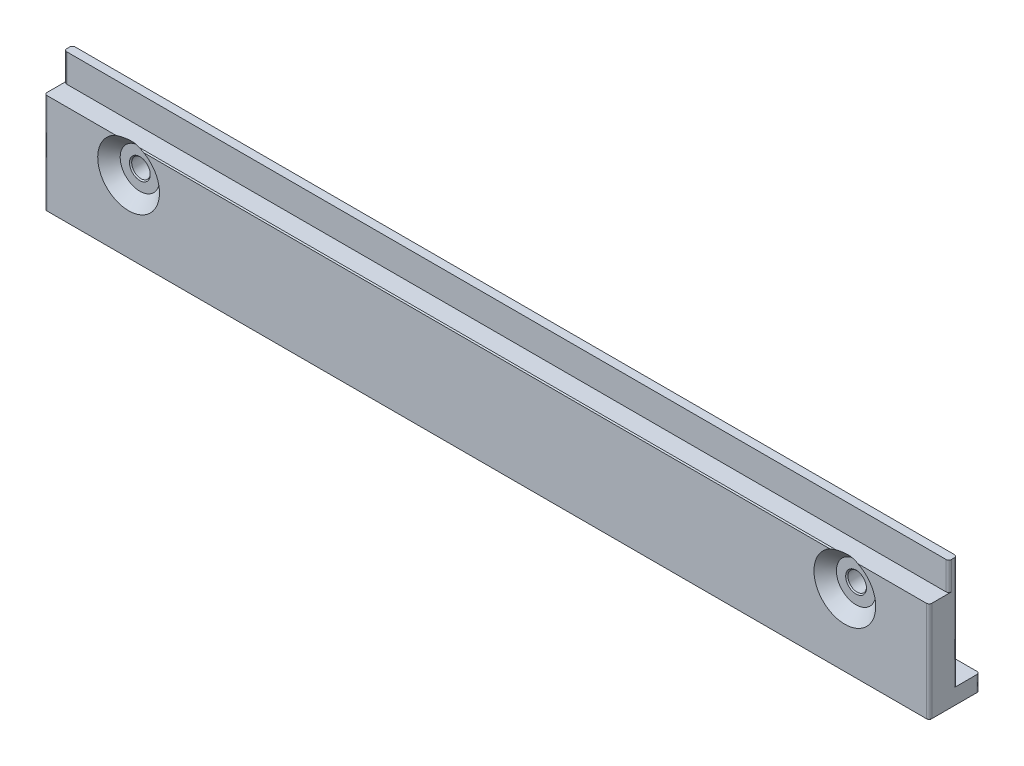
ISO-10303-21;
HEADER;
FILE_DESCRIPTION(('STEP AP214'),'2;1');
FILE_NAME('part.step','',(''),(''),'','','');
FILE_SCHEMA(('AUTOMOTIVE_DESIGN { 1 0 10303 214 1 1 1 1 }'));
ENDSEC;
DATA;
#1=APPLICATION_CONTEXT('core data for automotive mechanical design processes');
#2=APPLICATION_PROTOCOL_DEFINITION('international standard','automotive_design',2000,#1);
#3=PRODUCT_CONTEXT('',#1,'mechanical');
#4=PRODUCT('Part','Part','',(#3));
#5=PRODUCT_RELATED_PRODUCT_CATEGORY('part','',(#4));
#6=PRODUCT_DEFINITION_FORMATION('','',#4);
#7=PRODUCT_DEFINITION_CONTEXT('part definition',#1,'design');
#8=PRODUCT_DEFINITION('design','',#6,#7);
#9=PRODUCT_DEFINITION_SHAPE('','',#8);
#10=(LENGTH_UNIT() NAMED_UNIT(*) SI_UNIT(.MILLI.,.METRE.));
#11=(NAMED_UNIT(*) PLANE_ANGLE_UNIT() SI_UNIT($,.RADIAN.));
#12=(NAMED_UNIT(*) SI_UNIT($,.STERADIAN.) SOLID_ANGLE_UNIT());
#13=UNCERTAINTY_MEASURE_WITH_UNIT(LENGTH_MEASURE(1.E-05),#10,'distance_accuracy_value','');
#14=(GEOMETRIC_REPRESENTATION_CONTEXT(3) GLOBAL_UNCERTAINTY_ASSIGNED_CONTEXT((#13)) GLOBAL_UNIT_ASSIGNED_CONTEXT((#10,
#11,#12)) REPRESENTATION_CONTEXT('',''));
#15=CARTESIAN_POINT('',(0.,0.,0.));
#16=DIRECTION('',(0.,0.,1.));
#17=DIRECTION('',(1.,0.,0.));
#18=AXIS2_PLACEMENT_3D('',#15,#16,#17);
#19=CARTESIAN_POINT('',(78.75,10.,5.));
#20=DIRECTION('',(0.,-1.,0.));
#21=DIRECTION('',(1.,0.,0.));
#22=AXIS2_PLACEMENT_3D('',#19,#20,#21);
#23=PLANE('',#22);
#24=DIRECTION('',(0.,0.,-1.));
#25=VECTOR('',#24,1.);
#26=CARTESIAN_POINT('',(-78.75,10.,5.));
#27=LINE('',#26,#25);
#28=CARTESIAN_POINT('',(-78.75,10.,1.));
#29=VERTEX_POINT('',#28);
#30=CARTESIAN_POINT('',(-78.75,10.,0.5));
#31=VERTEX_POINT('',#30);
#32=EDGE_CURVE('E322',#29,#31,#27,.T.);
#33=ORIENTED_EDGE('',*,*,#32,.F.);
#34=CARTESIAN_POINT('',(-78.25,10.,1.));
#35=DIRECTION('',(0.,-1.,0.));
#36=DIRECTION('',(1.,0.,0.));
#37=AXIS2_PLACEMENT_3D('',#34,#35,#36);
#38=CIRCLE('',#37,0.5);
#39=CARTESIAN_POINT('',(-78.25,10.,1.5));
#40=VERTEX_POINT('',#39);
#41=EDGE_CURVE('E537',#29,#40,#38,.F.);
#42=ORIENTED_EDGE('',*,*,#41,.T.);
#43=DIRECTION('',(-1.,0.,0.));
#44=VECTOR('',#43,1.);
#45=CARTESIAN_POINT('',(-78.75,10.,1.5));
#46=LINE('',#45,#44);
#47=CARTESIAN_POINT('',(78.25,10.,1.5));
#48=VERTEX_POINT('',#47);
#49=EDGE_CURVE('E308',#48,#40,#46,.T.);
#50=ORIENTED_EDGE('',*,*,#49,.F.);
#51=CARTESIAN_POINT('',(78.25,10.,1.));
#52=DIRECTION('',(0.,-1.,0.));
#53=DIRECTION('',(1.,0.,0.));
#54=AXIS2_PLACEMENT_3D('',#51,#52,#53);
#55=CIRCLE('',#54,0.5);
#56=CARTESIAN_POINT('',(78.75,10.,1.));
#57=VERTEX_POINT('',#56);
#58=EDGE_CURVE('E331',#48,#57,#55,.F.);
#59=ORIENTED_EDGE('',*,*,#58,.T.);
#60=DIRECTION('',(0.,0.,-1.));
#61=VECTOR('',#60,1.);
#62=CARTESIAN_POINT('',(78.75,10.,5.));
#63=LINE('',#62,#61);
#64=CARTESIAN_POINT('',(78.75,10.,0.5));
#65=VERTEX_POINT('',#64);
#66=EDGE_CURVE('E184',#57,#65,#63,.T.);
#67=ORIENTED_EDGE('',*,*,#66,.T.);
#68=CARTESIAN_POINT('',(78.25,10.,0.5));
#69=DIRECTION('',(0.,-1.,0.));
#70=DIRECTION('',(1.,0.,0.));
#71=AXIS2_PLACEMENT_3D('',#68,#69,#70);
#72=CIRCLE('',#71,0.5);
#73=CARTESIAN_POINT('',(78.25,10.,0.));
#74=VERTEX_POINT('',#73);
#75=EDGE_CURVE('E328',#65,#74,#72,.F.);
#76=ORIENTED_EDGE('',*,*,#75,.T.);
#77=DIRECTION('',(-1.,0.,0.));
#78=VECTOR('',#77,1.);
#79=CARTESIAN_POINT('',(78.75,10.,0.));
#80=LINE('',#79,#78);
#81=CARTESIAN_POINT('',(-78.25,10.,0.));
#82=VERTEX_POINT('',#81);
#83=EDGE_CURVE('E319',#74,#82,#80,.T.);
#84=ORIENTED_EDGE('',*,*,#83,.T.);
#85=CARTESIAN_POINT('',(-78.25,10.,0.5));
#86=DIRECTION('',(0.,-1.,0.));
#87=DIRECTION('',(1.,0.,0.));
#88=AXIS2_PLACEMENT_3D('',#85,#86,#87);
#89=CIRCLE('',#88,0.5);
#90=EDGE_CURVE('E534',#82,#31,#89,.F.);
#91=ORIENTED_EDGE('',*,*,#90,.T.);
#92=EDGE_LOOP('',(#33,#42,#50,#59,#67,#76,#84,#91));
#93=FACE_BOUND('',#92,.T.);
#94=ADVANCED_FACE('F17',(#93),#23,.F.);
#95=CARTESIAN_POINT('',(-78.75,-10.,5.));
#96=DIRECTION('',(1.,0.,0.));
#97=DIRECTION('',(0.,0.,-1.));
#98=AXIS2_PLACEMENT_3D('',#95,#96,#97);
#99=PLANE('',#98);
#100=DIRECTION('',(0.,1.,0.));
#101=VECTOR('',#100,1.);
#102=CARTESIAN_POINT('',(-78.75,-13.,-3.5));
#103=LINE('',#102,#101);
#104=CARTESIAN_POINT('',(-78.75,-10.,-3.5));
#105=VERTEX_POINT('',#104);
#106=CARTESIAN_POINT('',(-78.75,-12.8,-3.5));
#107=VERTEX_POINT('',#106);
#108=EDGE_CURVE('E522',#105,#107,#103,.F.);
#109=ORIENTED_EDGE('',*,*,#108,.T.);
#110=DIRECTION('',(0.,0.,1.));
#111=VECTOR('',#110,1.);
#112=CARTESIAN_POINT('',(-78.75,-12.8,4.5));
#113=LINE('',#112,#111);
#114=CARTESIAN_POINT('',(-78.75,-12.8,4.5));
#115=VERTEX_POINT('',#114);
#116=EDGE_CURVE('E431',#107,#115,#113,.T.);
#117=ORIENTED_EDGE('',*,*,#116,.T.);
#118=DIRECTION('',(0.,-1.,0.));
#119=VECTOR('',#118,1.);
#120=CARTESIAN_POINT('',(-78.75,5.,4.5));
#121=LINE('',#120,#119);
#122=CARTESIAN_POINT('',(-78.75,5.,4.5));
#123=VERTEX_POINT('',#122);
#124=EDGE_CURVE('E520',#115,#123,#121,.F.);
#125=ORIENTED_EDGE('',*,*,#124,.T.);
#126=DIRECTION('',(0.,0.,1.));
#127=VECTOR('',#126,1.);
#128=CARTESIAN_POINT('',(-78.75,5.,1.5));
#129=LINE('',#128,#127);
#130=CARTESIAN_POINT('',(-78.75,5.,1.));
#131=VERTEX_POINT('',#130);
#132=EDGE_CURVE('E310',#131,#123,#129,.T.);
#133=ORIENTED_EDGE('',*,*,#132,.F.);
#134=DIRECTION('',(0.,-1.,0.));
#135=VECTOR('',#134,1.);
#136=CARTESIAN_POINT('',(-78.75,10.,1.));
#137=LINE('',#136,#135);
#138=EDGE_CURVE('E525',#131,#29,#137,.F.);
#139=ORIENTED_EDGE('',*,*,#138,.T.);
#140=ORIENTED_EDGE('',*,*,#32,.T.);
#141=DIRECTION('',(0.,-1.,0.));
#142=VECTOR('',#141,1.);
#143=CARTESIAN_POINT('',(-78.75,-10.,0.5));
#144=LINE('',#143,#142);
#145=CARTESIAN_POINT('',(-78.75,-10.,0.5));
#146=VERTEX_POINT('',#145);
#147=EDGE_CURVE('E526',#31,#146,#144,.T.);
#148=ORIENTED_EDGE('',*,*,#147,.T.);
#149=DIRECTION('',(0.,0.,-1.));
#150=VECTOR('',#149,1.);
#151=CARTESIAN_POINT('',(-78.75,-10.,162.528568837528));
#152=LINE('',#151,#150);
#153=EDGE_CURVE('E300',#146,#105,#152,.T.);
#154=ORIENTED_EDGE('',*,*,#153,.T.);
#155=EDGE_LOOP('',(#109,#117,#125,#133,#139,#140,#148,#154));
#156=FACE_BOUND('',#155,.T.);
#157=ADVANCED_FACE('F232',(#156),#99,.F.);
#158=CARTESIAN_POINT('',(78.75,-10.,5.));
#159=DIRECTION('',(-1.,0.,0.));
#160=DIRECTION('',(0.,0.,1.));
#161=AXIS2_PLACEMENT_3D('',#158,#159,#160);
#162=PLANE('',#161);
#163=DIRECTION('',(0.,1.,0.));
#164=VECTOR('',#163,1.);
#165=CARTESIAN_POINT('',(78.75,-13.,4.5));
#166=LINE('',#165,#164);
#167=CARTESIAN_POINT('',(78.75,5.,4.5));
#168=VERTEX_POINT('',#167);
#169=CARTESIAN_POINT('',(78.75,-12.8,4.5));
#170=VERTEX_POINT('',#169);
#171=EDGE_CURVE('E539',#168,#170,#166,.F.);
#172=ORIENTED_EDGE('',*,*,#171,.T.);
#173=DIRECTION('',(0.,0.,-1.));
#174=VECTOR('',#173,1.);
#175=CARTESIAN_POINT('',(78.75,-12.8,-3.5));
#176=LINE('',#175,#174);
#177=CARTESIAN_POINT('',(78.75,-12.8,-3.5));
#178=VERTEX_POINT('',#177);
#179=EDGE_CURVE('E423',#170,#178,#176,.T.);
#180=ORIENTED_EDGE('',*,*,#179,.T.);
#181=DIRECTION('',(0.,-1.,0.));
#182=VECTOR('',#181,1.);
#183=CARTESIAN_POINT('',(78.75,-10.,-3.5));
#184=LINE('',#183,#182);
#185=CARTESIAN_POINT('',(78.75,-10.,-3.5));
#186=VERTEX_POINT('',#185);
#187=EDGE_CURVE('E346',#178,#186,#184,.F.);
#188=ORIENTED_EDGE('',*,*,#187,.T.);
#189=DIRECTION('',(0.,0.,-1.));
#190=VECTOR('',#189,1.);
#191=CARTESIAN_POINT('',(78.75,-10.,162.528568837528));
#192=LINE('',#191,#190);
#193=CARTESIAN_POINT('',(78.75,-10.,0.5));
#194=VERTEX_POINT('',#193);
#195=EDGE_CURVE('E301',#194,#186,#192,.T.);
#196=ORIENTED_EDGE('',*,*,#195,.F.);
#197=DIRECTION('',(0.,1.,0.));
#198=VECTOR('',#197,1.);
#199=CARTESIAN_POINT('',(78.75,-10.,0.5));
#200=LINE('',#199,#198);
#201=EDGE_CURVE('E339',#194,#65,#200,.T.);
#202=ORIENTED_EDGE('',*,*,#201,.T.);
#203=ORIENTED_EDGE('',*,*,#66,.F.);
#204=DIRECTION('',(0.,1.,0.));
#205=VECTOR('',#204,1.);
#206=CARTESIAN_POINT('',(78.75,5.,1.));
#207=LINE('',#206,#205);
#208=CARTESIAN_POINT('',(78.75,5.,1.));
#209=VERTEX_POINT('',#208);
#210=EDGE_CURVE('E336',#57,#209,#207,.F.);
#211=ORIENTED_EDGE('',*,*,#210,.T.);
#212=DIRECTION('',(0.,0.,1.));
#213=VECTOR('',#212,1.);
#214=CARTESIAN_POINT('',(78.75,5.,1.5));
#215=LINE('',#214,#213);
#216=EDGE_CURVE('E312',#209,#168,#215,.T.);
#217=ORIENTED_EDGE('',*,*,#216,.T.);
#218=EDGE_LOOP('',(#172,#180,#188,#196,#202,#203,#211,#217));
#219=FACE_BOUND('',#218,.T.);
#220=ADVANCED_FACE('F226',(#219),#162,.F.);
#221=CARTESIAN_POINT('',(0.,0.,5.));
#222=DIRECTION('',(0.,0.,1.));
#223=DIRECTION('',(1.,0.,0.));
#224=AXIS2_PLACEMENT_3D('',#221,#222,#223);
#225=PLANE('',#224);
#226=DIRECTION('',(0.,-1.,0.));
#227=VECTOR('',#226,1.);
#228=CARTESIAN_POINT('',(-78.25,-13.,5.));
#229=LINE('',#228,#227);
#230=CARTESIAN_POINT('',(-78.25,5.,5.));
#231=VERTEX_POINT('',#230);
#232=CARTESIAN_POINT('',(-78.25,-12.8,5.));
#233=VERTEX_POINT('',#232);
#234=EDGE_CURVE('E348',#231,#233,#229,.T.);
#235=ORIENTED_EDGE('',*,*,#234,.T.);
#236=DIRECTION('',(1.,0.,0.));
#237=VECTOR('',#236,1.);
#238=CARTESIAN_POINT('',(0.,-12.8,5.));
#239=LINE('',#238,#237);
#240=CARTESIAN_POINT('',(78.25,-12.8,5.));
#241=VERTEX_POINT('',#240);
#242=EDGE_CURVE('E435',#233,#241,#239,.T.);
#243=ORIENTED_EDGE('',*,*,#242,.T.);
#244=DIRECTION('',(0.,1.,0.));
#245=VECTOR('',#244,1.);
#246=CARTESIAN_POINT('',(78.25,5.,5.));
#247=LINE('',#246,#245);
#248=CARTESIAN_POINT('',(78.25,5.,5.));
#249=VERTEX_POINT('',#248);
#250=EDGE_CURVE('E345',#241,#249,#247,.T.);
#251=ORIENTED_EDGE('',*,*,#250,.T.);
#252=DIRECTION('',(1.,0.,0.));
#253=VECTOR('',#252,1.);
#254=CARTESIAN_POINT('',(-78.75,5.,5.));
#255=LINE('',#254,#253);
#256=CARTESIAN_POINT('',(66.0412878474779,5.,5.));
#257=VERTEX_POINT('',#256);
#258=EDGE_CURVE('E193',#257,#249,#255,.T.);
#259=ORIENTED_EDGE('',*,*,#258,.F.);
#260=CARTESIAN_POINT('',(63.75,0.,5.));
#261=DIRECTION('',(0.,0.,1.));
#262=DIRECTION('',(1.,0.,0.));
#263=AXIS2_PLACEMENT_3D('',#260,#261,#262);
#264=CIRCLE('',#263,5.5);
#265=CARTESIAN_POINT('',(61.0648556835806,4.8,5.));
#266=VERTEX_POINT('',#265);
#267=EDGE_CURVE('E183',#257,#266,#264,.F.);
#268=ORIENTED_EDGE('',*,*,#267,.T.);
#269=DIRECTION('',(-1.,0.,0.));
#270=VECTOR('',#269,1.);
#271=CARTESIAN_POINT('',(-61.458712152522,4.8,5.));
#272=LINE('',#271,#270);
#273=CARTESIAN_POINT('',(-61.0648556835805,4.8,5.));
#274=VERTEX_POINT('',#273);
#275=EDGE_CURVE('E182',#266,#274,#272,.T.);
#276=ORIENTED_EDGE('',*,*,#275,.T.);
#277=CARTESIAN_POINT('',(-63.75,0.,5.));
#278=DIRECTION('',(0.,0.,1.));
#279=DIRECTION('',(1.,0.,0.));
#280=AXIS2_PLACEMENT_3D('',#277,#278,#279);
#281=CIRCLE('',#280,5.5);
#282=CARTESIAN_POINT('',(-66.041287847478,5.,5.));
#283=VERTEX_POINT('',#282);
#284=EDGE_CURVE('E175',#274,#283,#281,.F.);
#285=ORIENTED_EDGE('',*,*,#284,.T.);
#286=EDGE_CURVE('E179',#231,#283,#255,.T.);
#287=ORIENTED_EDGE('',*,*,#286,.F.);
#288=EDGE_LOOP('',(#235,#243,#251,#259,#268,#276,#285,#287));
#289=FACE_BOUND('',#288,.T.);
#290=ADVANCED_FACE('F178',(#289),#225,.T.);
#291=CARTESIAN_POINT('',(0.,0.,0.));
#292=DIRECTION('',(0.,0.,1.));
#293=DIRECTION('',(1.,0.,0.));
#294=AXIS2_PLACEMENT_3D('',#291,#292,#293);
#295=PLANE('',#294);
#296=CARTESIAN_POINT('',(-63.75,0.,0.));
#297=DIRECTION('',(0.,0.,1.));
#298=DIRECTION('',(1.,0.,0.));
#299=AXIS2_PLACEMENT_3D('',#296,#297,#298);
#300=CIRCLE('',#299,1.85);
#301=CARTESIAN_POINT('',(-61.9,0.,0.));
#302=VERTEX_POINT('',#301);
#303=EDGE_CURVE('E382',#302,#302,#300,.T.);
#304=ORIENTED_EDGE('',*,*,#303,.T.);
#305=EDGE_LOOP('',(#304));
#306=FACE_BOUND('',#305,.T.);
#307=CARTESIAN_POINT('',(63.75,0.,0.));
#308=DIRECTION('',(0.,0.,1.));
#309=DIRECTION('',(1.,0.,0.));
#310=AXIS2_PLACEMENT_3D('',#307,#308,#309);
#311=CIRCLE('',#310,1.85);
#312=CARTESIAN_POINT('',(65.6,0.,0.));
#313=VERTEX_POINT('',#312);
#314=EDGE_CURVE('E379',#313,#313,#311,.T.);
#315=ORIENTED_EDGE('',*,*,#314,.T.);
#316=EDGE_LOOP('',(#315));
#317=FACE_BOUND('',#316,.T.);
#318=DIRECTION('',(1.,0.,0.));
#319=VECTOR('',#318,1.);
#320=CARTESIAN_POINT('',(78.75,-10.,0.));
#321=LINE('',#320,#319);
#322=CARTESIAN_POINT('',(-78.25,-10.,0.));
#323=VERTEX_POINT('',#322);
#324=CARTESIAN_POINT('',(78.25,-10.,0.));
#325=VERTEX_POINT('',#324);
#326=EDGE_CURVE('E315',#323,#325,#321,.T.);
#327=ORIENTED_EDGE('',*,*,#326,.F.);
#328=DIRECTION('',(0.,-1.,0.));
#329=VECTOR('',#328,1.);
#330=CARTESIAN_POINT('',(-78.25,0.,0.));
#331=LINE('',#330,#329);
#332=EDGE_CURVE('E359',#323,#82,#331,.F.);
#333=ORIENTED_EDGE('',*,*,#332,.T.);
#334=ORIENTED_EDGE('',*,*,#83,.F.);
#335=DIRECTION('',(0.,1.,0.));
#336=VECTOR('',#335,1.);
#337=CARTESIAN_POINT('',(78.25,0.,0.));
#338=LINE('',#337,#336);
#339=EDGE_CURVE('E357',#74,#325,#338,.F.);
#340=ORIENTED_EDGE('',*,*,#339,.T.);
#341=EDGE_LOOP('',(#327,#333,#334,#340));
#342=FACE_BOUND('',#341,.T.);
#343=ADVANCED_FACE('F221',(#306,#317,#342),#295,.F.);
#344=CARTESIAN_POINT('',(-78.75,5.,1.5));
#345=DIRECTION('',(0.,-1.,0.));
#346=DIRECTION('',(0.,0.,-1.));
#347=AXIS2_PLACEMENT_3D('',#344,#345,#346);
#348=PLANE('',#347);
#349=CARTESIAN_POINT('',(-66.041287847478,5.,5.));
#350=CARTESIAN_POINT('',(-65.8724757679365,5.,4.92966274358956));
#351=CARTESIAN_POINT('',(-65.701181038771,5.,4.86472998503193));
#352=CARTESIAN_POINT('',(-65.3535349104336,5.,4.74828115501808));
#353=CARTESIAN_POINT('',(-65.177169517932,5.,4.69680717410065));
#354=CARTESIAN_POINT('',(-64.8221004929914,5.,4.61077968152695));
#355=CARTESIAN_POINT('',(-64.6434371133418,5.,4.57606419733549));
#356=CARTESIAN_POINT('',(-64.2836627773588,5.,4.52525323705327));
#357=CARTESIAN_POINT('',(-64.102555302869,5.,4.50913362601007));
#358=CARTESIAN_POINT('',(-63.7489590238093,5.,4.49703831389821));
#359=CARTESIAN_POINT('',(-63.5765042124073,5.,4.50007255820053));
#360=CARTESIAN_POINT('',(-63.2327457392313,5.,4.52375583265064));
#361=CARTESIAN_POINT('',(-63.0614426843159,5.,4.54441351184173));
#362=CARTESIAN_POINT('',(-62.7217509611419,5.,4.60188749385059));
#363=CARTESIAN_POINT('',(-62.5533603453605,5.,4.63869252760541));
#364=CARTESIAN_POINT('',(-62.2202659673292,5.,4.72630209214194));
#365=CARTESIAN_POINT('',(-62.05556304211,5.,4.77710976709622));
#366=CARTESIAN_POINT('',(-61.8196483397779,5.,4.85924732673286));
#367=CARTESIAN_POINT('',(-61.7467786769551,5.,4.88594575980451));
#368=CARTESIAN_POINT('',(-61.6020432888466,5.,4.94143984415094));
#369=CARTESIAN_POINT('',(-61.5301755630264,5.,4.97023027145717));
#370=CARTESIAN_POINT('',(-61.458712152522,5.,5.));
#371=B_SPLINE_CURVE_WITH_KNOTS('',3,(#349,#350,#351,#352,#353,#354,#355,#356,#357,#358,#359,
#360,#361,#362,#363,#364,#365,#366,#367,#368,#369,#370),.UNSPECIFIED.,.F.,.F.,(4,2,2,2,2,2,2,2,
2,2,4),(0.,0.548865760559844,1.09942803234197,1.64455687970927,2.18897742404553,
2.70549587350568,3.22226796035848,3.73867996986825,4.2552080298565,4.48800186581799,
4.72023314125283),.UNSPECIFIED.);
#372=CARTESIAN_POINT('',(-61.9921604168752,5.,4.8));
#373=VERTEX_POINT('',#372);
#374=EDGE_CURVE('E188',#283,#373,#371,.T.);
#375=ORIENTED_EDGE('',*,*,#374,.T.);
#376=DIRECTION('',(1.,0.,0.));
#377=VECTOR('',#376,1.);
#378=CARTESIAN_POINT('',(61.4587121525222,5.,4.8));
#379=LINE('',#378,#377);
#380=CARTESIAN_POINT('',(61.9921604168754,5.,4.8));
#381=VERTEX_POINT('',#380);
#382=EDGE_CURVE('E255',#373,#381,#379,.T.);
#383=ORIENTED_EDGE('',*,*,#382,.T.);
#384=CARTESIAN_POINT('',(61.4587121525222,5.,5.));
#385=CARTESIAN_POINT('',(61.6275242320637,5.,4.92966274358951));
#386=CARTESIAN_POINT('',(61.7988189612292,5.,4.86472998503187));
#387=CARTESIAN_POINT('',(62.1464650895666,5.,4.74828115501803));
#388=CARTESIAN_POINT('',(62.3228304820682,5.,4.69680717410061));
#389=CARTESIAN_POINT('',(62.6778995070088,5.,4.61077968152691));
#390=CARTESIAN_POINT('',(62.8565628866583,5.,4.57606419733544));
#391=CARTESIAN_POINT('',(63.2163372226414,5.,4.52525323705327));
#392=CARTESIAN_POINT('',(63.3974446971311,5.,4.50913362601013));
#393=CARTESIAN_POINT('',(63.7510409761908,5.,4.49703831389827));
#394=CARTESIAN_POINT('',(63.9234957875928,5.,4.50007255820055));
#395=CARTESIAN_POINT('',(64.2672542607688,5.,4.52375583265062));
#396=CARTESIAN_POINT('',(64.4385573156842,5.,4.54441351184173));
#397=CARTESIAN_POINT('',(64.7782490388581,5.,4.60188749385059));
#398=CARTESIAN_POINT('',(64.9466396546396,5.,4.6386925276054));
#399=CARTESIAN_POINT('',(65.2797340326708,5.,4.72630209214197));
#400=CARTESIAN_POINT('',(65.44443695789,5.,4.7771097670963));
#401=CARTESIAN_POINT('',(65.6803516602221,5.,4.85924732673291));
#402=CARTESIAN_POINT('',(65.7532213230449,5.,4.88594575980452));
#403=CARTESIAN_POINT('',(65.8979567111533,5.,4.9414398441509));
#404=CARTESIAN_POINT('',(65.9698244369736,5.,4.97023027145712));
#405=CARTESIAN_POINT('',(66.0412878474779,5.,5.));
#406=B_SPLINE_CURVE_WITH_KNOTS('',3,(#384,#385,#386,#387,#388,#389,#390,#391,#392,#393,#394,
#395,#396,#397,#398,#399,#400,#401,#402,#403,#404,#405),.UNSPECIFIED.,.F.,.F.,(4,2,2,2,2,2,2,2,
2,2,4),(0.,0.548865760559839,1.09942803234195,1.64455687970921,2.18897742404544,
2.70549587350558,3.22226796035835,3.73867996986811,4.25520802985632,4.48800186581776,
4.72023314125254),.UNSPECIFIED.);
#407=EDGE_CURVE('E196',#381,#257,#406,.T.);
#408=ORIENTED_EDGE('',*,*,#407,.T.);
#409=ORIENTED_EDGE('',*,*,#258,.T.);
#410=CARTESIAN_POINT('',(78.25,5.,4.5));
#411=DIRECTION('',(0.,-1.,0.));
#412=DIRECTION('',(0.,0.,-1.));
#413=AXIS2_PLACEMENT_3D('',#410,#411,#412);
#414=CIRCLE('',#413,0.5);
#415=EDGE_CURVE('E354',#249,#168,#414,.F.);
#416=ORIENTED_EDGE('',*,*,#415,.T.);
#417=ORIENTED_EDGE('',*,*,#216,.F.);
#418=CARTESIAN_POINT('',(78.25,5.,1.));
#419=DIRECTION('',(0.,-1.,0.));
#420=DIRECTION('',(0.,0.,-1.));
#421=AXIS2_PLACEMENT_3D('',#418,#419,#420);
#422=CIRCLE('',#421,0.5);
#423=CARTESIAN_POINT('',(78.25,5.,1.5));
#424=VERTEX_POINT('',#423);
#425=EDGE_CURVE('E344',#209,#424,#422,.T.);
#426=ORIENTED_EDGE('',*,*,#425,.T.);
#427=DIRECTION('',(1.,0.,0.));
#428=VECTOR('',#427,1.);
#429=CARTESIAN_POINT('',(-78.75,5.,1.5));
#430=LINE('',#429,#428);
#431=CARTESIAN_POINT('',(-78.25,5.,1.5));
#432=VERTEX_POINT('',#431);
#433=EDGE_CURVE('E192',#432,#424,#430,.T.);
#434=ORIENTED_EDGE('',*,*,#433,.F.);
#435=CARTESIAN_POINT('',(-78.25,5.,1.));
#436=DIRECTION('',(0.,-1.,0.));
#437=DIRECTION('',(0.,0.,-1.));
#438=AXIS2_PLACEMENT_3D('',#435,#436,#437);
#439=CIRCLE('',#438,0.5);
#440=EDGE_CURVE('E370',#432,#131,#439,.T.);
#441=ORIENTED_EDGE('',*,*,#440,.T.);
#442=ORIENTED_EDGE('',*,*,#132,.T.);
#443=CARTESIAN_POINT('',(-78.25,5.,4.5));
#444=DIRECTION('',(0.,-1.,0.));
#445=DIRECTION('',(0.,0.,-1.));
#446=AXIS2_PLACEMENT_3D('',#443,#444,#445);
#447=CIRCLE('',#446,0.5);
#448=EDGE_CURVE('E191',#123,#231,#447,.F.);
#449=ORIENTED_EDGE('',*,*,#448,.T.);
#450=ORIENTED_EDGE('',*,*,#286,.T.);
#451=EDGE_LOOP('',(#375,#383,#408,#409,#416,#417,#426,#434,#441,#442,#449,#450));
#452=FACE_BOUND('',#451,.T.);
#453=ADVANCED_FACE('F187',(#452),#348,.F.);
#454=CARTESIAN_POINT('',(0.,0.,1.5));
#455=DIRECTION('',(0.,0.,1.));
#456=DIRECTION('',(1.,0.,0.));
#457=AXIS2_PLACEMENT_3D('',#454,#455,#456);
#458=PLANE('',#457);
#459=ORIENTED_EDGE('',*,*,#49,.T.);
#460=DIRECTION('',(0.,-1.,0.));
#461=VECTOR('',#460,1.);
#462=CARTESIAN_POINT('',(-78.25,5.,1.5));
#463=LINE('',#462,#461);
#464=EDGE_CURVE('E589',#40,#432,#463,.T.);
#465=ORIENTED_EDGE('',*,*,#464,.T.);
#466=ORIENTED_EDGE('',*,*,#433,.T.);
#467=DIRECTION('',(0.,1.,0.));
#468=VECTOR('',#467,1.);
#469=CARTESIAN_POINT('',(78.25,10.,1.5));
#470=LINE('',#469,#468);
#471=EDGE_CURVE('E198',#424,#48,#470,.T.);
#472=ORIENTED_EDGE('',*,*,#471,.T.);
#473=EDGE_LOOP('',(#459,#465,#466,#472));
#474=FACE_BOUND('',#473,.T.);
#475=ADVANCED_FACE('F220',(#474),#458,.T.);
#476=CARTESIAN_POINT('',(78.75,-13.,162.528568837528));
#477=DIRECTION('',(0.,-1.,0.));
#478=DIRECTION('',(0.,0.,-1.));
#479=AXIS2_PLACEMENT_3D('',#476,#477,#478);
#480=PLANE('',#479);
#481=DIRECTION('',(0.,0.,1.));
#482=VECTOR('',#481,1.);
#483=CARTESIAN_POINT('',(78.55,-13.,4.5));
#484=LINE('',#483,#482);
#485=CARTESIAN_POINT('',(78.55,-13.,-3.5));
#486=VERTEX_POINT('',#485);
#487=CARTESIAN_POINT('',(78.55,-13.,4.5));
#488=VERTEX_POINT('',#487);
#489=EDGE_CURVE('E415',#486,#488,#484,.T.);
#490=ORIENTED_EDGE('',*,*,#489,.T.);
#491=CARTESIAN_POINT('',(78.25,-13.,4.5));
#492=DIRECTION('',(0.,-1.,0.));
#493=DIRECTION('',(0.,0.,-1.));
#494=AXIS2_PLACEMENT_3D('',#491,#492,#493);
#495=CIRCLE('',#494,0.299999999999994);
#496=CARTESIAN_POINT('',(78.25,-13.,4.8));
#497=VERTEX_POINT('',#496);
#498=EDGE_CURVE('E417',#488,#497,#495,.T.);
#499=ORIENTED_EDGE('',*,*,#498,.T.);
#500=DIRECTION('',(-1.,0.,0.));
#501=VECTOR('',#500,1.);
#502=CARTESIAN_POINT('',(78.75,-13.,4.8));
#503=LINE('',#502,#501);
#504=CARTESIAN_POINT('',(-78.25,-13.,4.8));
#505=VERTEX_POINT('',#504);
#506=EDGE_CURVE('E403',#497,#505,#503,.T.);
#507=ORIENTED_EDGE('',*,*,#506,.T.);
#508=CARTESIAN_POINT('',(-78.25,-13.,4.5));
#509=DIRECTION('',(0.,-1.,0.));
#510=DIRECTION('',(0.,0.,-1.));
#511=AXIS2_PLACEMENT_3D('',#508,#509,#510);
#512=CIRCLE('',#511,0.299999999999994);
#513=CARTESIAN_POINT('',(-78.55,-13.,4.5));
#514=VERTEX_POINT('',#513);
#515=EDGE_CURVE('E405',#505,#514,#512,.T.);
#516=ORIENTED_EDGE('',*,*,#515,.T.);
#517=DIRECTION('',(0.,0.,-1.));
#518=VECTOR('',#517,1.);
#519=CARTESIAN_POINT('',(-78.55,-13.,-3.5));
#520=LINE('',#519,#518);
#521=CARTESIAN_POINT('',(-78.55,-13.,-3.5));
#522=VERTEX_POINT('',#521);
#523=EDGE_CURVE('E407',#514,#522,#520,.T.);
#524=ORIENTED_EDGE('',*,*,#523,.T.);
#525=CARTESIAN_POINT('',(-78.25,-13.,-3.5));
#526=DIRECTION('',(0.,-1.,0.));
#527=DIRECTION('',(0.,0.,-1.));
#528=AXIS2_PLACEMENT_3D('',#525,#526,#527);
#529=CIRCLE('',#528,0.299999999999994);
#530=CARTESIAN_POINT('',(-78.25,-13.,-3.8));
#531=VERTEX_POINT('',#530);
#532=EDGE_CURVE('E409',#522,#531,#529,.T.);
#533=ORIENTED_EDGE('',*,*,#532,.T.);
#534=DIRECTION('',(1.,0.,0.));
#535=VECTOR('',#534,1.);
#536=CARTESIAN_POINT('',(78.75,-13.,-3.8));
#537=LINE('',#536,#535);
#538=CARTESIAN_POINT('',(78.25,-13.,-3.8));
#539=VERTEX_POINT('',#538);
#540=EDGE_CURVE('E411',#531,#539,#537,.T.);
#541=ORIENTED_EDGE('',*,*,#540,.T.);
#542=CARTESIAN_POINT('',(78.25,-13.,-3.5));
#543=DIRECTION('',(0.,-1.,0.));
#544=DIRECTION('',(0.,0.,-1.));
#545=AXIS2_PLACEMENT_3D('',#542,#543,#544);
#546=CIRCLE('',#545,0.299999999999994);
#547=EDGE_CURVE('E413',#539,#486,#546,.T.);
#548=ORIENTED_EDGE('',*,*,#547,.T.);
#549=EDGE_LOOP('',(#490,#499,#507,#516,#524,#533,#541,#548));
#550=FACE_BOUND('',#549,.T.);
#551=ADVANCED_FACE('F554',(#550),#480,.T.);
#552=CARTESIAN_POINT('',(78.75,-10.,162.528568837528));
#553=DIRECTION('',(0.,1.,0.));
#554=DIRECTION('',(-1.,0.,0.));
#555=AXIS2_PLACEMENT_3D('',#552,#553,#554);
#556=PLANE('',#555);
#557=DIRECTION('',(1.,0.,0.));
#558=VECTOR('',#557,1.);
#559=CARTESIAN_POINT('',(78.75,-10.,-4.));
#560=LINE('',#559,#558);
#561=CARTESIAN_POINT('',(-78.25,-10.,-4.));
#562=VERTEX_POINT('',#561);
#563=CARTESIAN_POINT('',(78.25,-10.,-4.));
#564=VERTEX_POINT('',#563);
#565=EDGE_CURVE('E295',#562,#564,#560,.T.);
#566=ORIENTED_EDGE('',*,*,#565,.F.);
#567=CARTESIAN_POINT('',(-78.25,-10.,-3.5));
#568=DIRECTION('',(0.,1.,0.));
#569=DIRECTION('',(-1.,0.,0.));
#570=AXIS2_PLACEMENT_3D('',#567,#568,#569);
#571=CIRCLE('',#570,0.5);
#572=EDGE_CURVE('E368',#562,#105,#571,.T.);
#573=ORIENTED_EDGE('',*,*,#572,.T.);
#574=ORIENTED_EDGE('',*,*,#153,.F.);
#575=CARTESIAN_POINT('',(-78.25,-10.,0.5));
#576=DIRECTION('',(0.,1.,0.));
#577=DIRECTION('',(-1.,0.,0.));
#578=AXIS2_PLACEMENT_3D('',#575,#576,#577);
#579=CIRCLE('',#578,0.5);
#580=EDGE_CURVE('E374',#146,#323,#579,.F.);
#581=ORIENTED_EDGE('',*,*,#580,.T.);
#582=ORIENTED_EDGE('',*,*,#326,.T.);
#583=CARTESIAN_POINT('',(78.25,-10.,0.5));
#584=DIRECTION('',(0.,1.,0.));
#585=DIRECTION('',(-1.,0.,0.));
#586=AXIS2_PLACEMENT_3D('',#583,#584,#585);
#587=CIRCLE('',#586,0.5);
#588=EDGE_CURVE('E376',#325,#194,#587,.F.);
#589=ORIENTED_EDGE('',*,*,#588,.T.);
#590=ORIENTED_EDGE('',*,*,#195,.T.);
#591=CARTESIAN_POINT('',(78.25,-10.,-3.5));
#592=DIRECTION('',(0.,1.,0.));
#593=DIRECTION('',(-1.,0.,0.));
#594=AXIS2_PLACEMENT_3D('',#591,#592,#593);
#595=CIRCLE('',#594,0.5);
#596=EDGE_CURVE('E366',#186,#564,#595,.T.);
#597=ORIENTED_EDGE('',*,*,#596,.T.);
#598=EDGE_LOOP('',(#566,#573,#574,#581,#582,#589,#590,#597));
#599=FACE_BOUND('',#598,.T.);
#600=ADVANCED_FACE('F570',(#599),#556,.T.);
#601=CARTESIAN_POINT('',(0.,0.,-4.));
#602=DIRECTION('',(0.,0.,-1.));
#603=DIRECTION('',(-1.,0.,0.));
#604=AXIS2_PLACEMENT_3D('',#601,#602,#603);
#605=PLANE('',#604);
#606=DIRECTION('',(0.,-1.,0.));
#607=VECTOR('',#606,1.);
#608=CARTESIAN_POINT('',(78.25,-13.,-4.));
#609=LINE('',#608,#607);
#610=CARTESIAN_POINT('',(78.25,-12.8,-4.));
#611=VERTEX_POINT('',#610);
#612=EDGE_CURVE('E361',#564,#611,#609,.T.);
#613=ORIENTED_EDGE('',*,*,#612,.T.);
#614=DIRECTION('',(-1.,0.,0.));
#615=VECTOR('',#614,1.);
#616=CARTESIAN_POINT('',(0.,-12.8,-4.));
#617=LINE('',#616,#615);
#618=CARTESIAN_POINT('',(-78.25,-12.8,-4.));
#619=VERTEX_POINT('',#618);
#620=EDGE_CURVE('E427',#611,#619,#617,.T.);
#621=ORIENTED_EDGE('',*,*,#620,.T.);
#622=DIRECTION('',(0.,1.,0.));
#623=VECTOR('',#622,1.);
#624=CARTESIAN_POINT('',(-78.25,-10.,-4.));
#625=LINE('',#624,#623);
#626=EDGE_CURVE('E364',#619,#562,#625,.T.);
#627=ORIENTED_EDGE('',*,*,#626,.T.);
#628=ORIENTED_EDGE('',*,*,#565,.T.);
#629=EDGE_LOOP('',(#613,#621,#627,#628));
#630=FACE_BOUND('',#629,.T.);
#631=ADVANCED_FACE('F565',(#630),#605,.T.);
#632=CARTESIAN_POINT('',(-63.75,0.,5.));
#633=DIRECTION('',(0.,0.,-1.));
#634=DIRECTION('',(-1.,0.,0.));
#635=AXIS2_PLACEMENT_3D('',#632,#633,#634);
#636=CYLINDRICAL_SURFACE('',#635,1.65);
#637=CARTESIAN_POINT('',(-63.75,0.,0.199999999999979));
#638=DIRECTION('',(0.,0.,1.));
#639=DIRECTION('',(1.,0.,0.));
#640=AXIS2_PLACEMENT_3D('',#637,#638,#639);
#641=CIRCLE('',#640,1.65);
#642=CARTESIAN_POINT('',(-62.1,0.,0.199999999999979));
#643=VERTEX_POINT('',#642);
#644=EDGE_CURVE('E388',#643,#643,#641,.F.);
#645=ORIENTED_EDGE('',*,*,#644,.T.);
#646=EDGE_LOOP('',(#645));
#647=FACE_BOUND('',#646,.T.);
#648=CARTESIAN_POINT('',(-63.75,0.,2.8));
#649=DIRECTION('',(0.,0.,-1.));
#650=DIRECTION('',(-1.,0.,0.));
#651=AXIS2_PLACEMENT_3D('',#648,#649,#650);
#652=CIRCLE('',#651,1.65);
#653=CARTESIAN_POINT('',(-65.4,0.,2.8));
#654=VERTEX_POINT('',#653);
#655=EDGE_CURVE('E385',#654,#654,#652,.F.);
#656=ORIENTED_EDGE('',*,*,#655,.T.);
#657=EDGE_LOOP('',(#656));
#658=FACE_BOUND('',#657,.T.);
#659=ADVANCED_FACE('F606',(#647,#658),#636,.F.);
#660=CARTESIAN_POINT('',(63.75,0.,5.));
#661=DIRECTION('',(0.,0.,-1.));
#662=DIRECTION('',(-1.,0.,0.));
#663=AXIS2_PLACEMENT_3D('',#660,#661,#662);
#664=CYLINDRICAL_SURFACE('',#663,1.65);
#665=CARTESIAN_POINT('',(63.75,0.,0.199999999999979));
#666=DIRECTION('',(0.,0.,1.));
#667=DIRECTION('',(1.,0.,0.));
#668=AXIS2_PLACEMENT_3D('',#665,#666,#667);
#669=CIRCLE('',#668,1.65);
#670=CARTESIAN_POINT('',(65.4,0.,0.199999999999979));
#671=VERTEX_POINT('',#670);
#672=EDGE_CURVE('E397',#671,#671,#669,.F.);
#673=ORIENTED_EDGE('',*,*,#672,.T.);
#674=EDGE_LOOP('',(#673));
#675=FACE_BOUND('',#674,.T.);
#676=CARTESIAN_POINT('',(63.75,0.,2.80000000000003));
#677=DIRECTION('',(0.,0.,-1.));
#678=DIRECTION('',(-1.,0.,0.));
#679=AXIS2_PLACEMENT_3D('',#676,#677,#678);
#680=CIRCLE('',#679,1.65);
#681=CARTESIAN_POINT('',(62.1,0.,2.80000000000003));
#682=VERTEX_POINT('',#681);
#683=EDGE_CURVE('E394',#682,#682,#680,.F.);
#684=ORIENTED_EDGE('',*,*,#683,.T.);
#685=EDGE_LOOP('',(#684));
#686=FACE_BOUND('',#685,.T.);
#687=ADVANCED_FACE('F609',(#675,#686),#664,.F.);
#688=CARTESIAN_POINT('',(63.75,0.,3.));
#689=DIRECTION('',(0.,0.,-1.));
#690=DIRECTION('',(-1.,0.,0.));
#691=AXIS2_PLACEMENT_3D('',#688,#689,#690);
#692=PLANE('',#691);
#693=CARTESIAN_POINT('',(63.75,0.,3.));
#694=DIRECTION('',(0.,0.,-1.));
#695=DIRECTION('',(-1.,0.,0.));
#696=AXIS2_PLACEMENT_3D('',#693,#694,#695);
#697=CIRCLE('',#696,1.84999999999998);
#698=CARTESIAN_POINT('',(61.9,0.,3.));
#699=VERTEX_POINT('',#698);
#700=EDGE_CURVE('E400',#699,#699,#697,.T.);
#701=ORIENTED_EDGE('',*,*,#700,.T.);
#702=EDGE_LOOP('',(#701));
#703=FACE_BOUND('',#702,.T.);
#704=CARTESIAN_POINT('',(63.75,0.,3.));
#705=DIRECTION('',(0.,0.,-1.));
#706=DIRECTION('',(-1.,0.,0.));
#707=AXIS2_PLACEMENT_3D('',#704,#705,#706);
#708=CIRCLE('',#707,3.5);
#709=CARTESIAN_POINT('',(60.25,0.,3.));
#710=VERTEX_POINT('',#709);
#711=EDGE_CURVE('E290',#710,#710,#708,.T.);
#712=ORIENTED_EDGE('',*,*,#711,.F.);
#713=EDGE_LOOP('',(#712));
#714=FACE_BOUND('',#713,.T.);
#715=ADVANCED_FACE('F613',(#703,#714),#692,.F.);
#716=CARTESIAN_POINT('',(-63.75,0.,3.));
#717=DIRECTION('',(0.,0.,-1.));
#718=DIRECTION('',(-1.,0.,0.));
#719=AXIS2_PLACEMENT_3D('',#716,#717,#718);
#720=PLANE('',#719);
#721=CARTESIAN_POINT('',(-63.75,0.,3.));
#722=DIRECTION('',(0.,0.,-1.));
#723=DIRECTION('',(-1.,0.,0.));
#724=AXIS2_PLACEMENT_3D('',#721,#722,#723);
#725=CIRCLE('',#724,1.85);
#726=CARTESIAN_POINT('',(-65.6,0.,3.));
#727=VERTEX_POINT('',#726);
#728=EDGE_CURVE('E391',#727,#727,#725,.T.);
#729=ORIENTED_EDGE('',*,*,#728,.T.);
#730=EDGE_LOOP('',(#729));
#731=FACE_BOUND('',#730,.T.);
#732=CARTESIAN_POINT('',(-63.75,0.,3.));
#733=DIRECTION('',(0.,0.,-1.));
#734=DIRECTION('',(-1.,0.,0.));
#735=AXIS2_PLACEMENT_3D('',#732,#733,#734);
#736=CIRCLE('',#735,3.5);
#737=CARTESIAN_POINT('',(-67.25,0.,3.));
#738=VERTEX_POINT('',#737);
#739=EDGE_CURVE('E284',#738,#738,#736,.T.);
#740=ORIENTED_EDGE('',*,*,#739,.F.);
#741=EDGE_LOOP('',(#740));
#742=FACE_BOUND('',#741,.T.);
#743=ADVANCED_FACE('F246',(#731,#742),#720,.F.);
#744=CARTESIAN_POINT('',(63.75,0.,5.));
#745=DIRECTION('',(0.,0.,1.));
#746=DIRECTION('',(1.,0.,0.));
#747=AXIS2_PLACEMENT_3D('',#744,#745,#746);
#748=CONICAL_SURFACE('',#747,5.5,0.785398163397441);
#749=ORIENTED_EDGE('',*,*,#711,.T.);
#750=EDGE_LOOP('',(#749));
#751=FACE_BOUND('',#750,.T.);
#752=ORIENTED_EDGE('',*,*,#407,.F.);
#753=CARTESIAN_POINT('',(61.9921604168754,5.,4.8));
#754=CARTESIAN_POINT('',(61.913544584407,4.98658386602592,4.81341613397408));
#755=CARTESIAN_POINT('',(61.8352213752734,4.97231609489407,4.82768390510593));
#756=CARTESIAN_POINT('',(61.6792785964846,4.94214481617641,4.85785518382359));
#757=CARTESIAN_POINT('',(61.6016584871783,4.92624270388267,4.87375729611733));
#758=CARTESIAN_POINT('',(61.4471102929477,4.89284808803918,4.90715191196082));
#759=CARTESIAN_POINT('',(61.3701821785687,4.87535565253684,4.92464434746316));
#760=CARTESIAN_POINT('',(61.216991824186,4.8388225205051,4.9611774794949));
#761=CARTESIAN_POINT('',(61.1407302037252,4.81978052446427,4.98021947553573));
#762=CARTESIAN_POINT('',(61.0648556835806,4.8,5.));
#763=B_SPLINE_CURVE_WITH_KNOTS('',3,(#753,#754,#755,#756,#757,#758,#759,#760,#761,#762),
.UNSPECIFIED.,.F.,.F.,(4,2,2,2,4),(0.,0.242606654212614,0.485007880886525,0.727398740475187,
0.969995014230268),.UNSPECIFIED.);
#764=EDGE_CURVE('E28',#381,#266,#763,.T.);
#765=ORIENTED_EDGE('',*,*,#764,.T.);
#766=ORIENTED_EDGE('',*,*,#267,.F.);
#767=EDGE_LOOP('',(#752,#765,#766));
#768=FACE_BOUND('',#767,.T.);
#769=ADVANCED_FACE('F240',(#751,#768),#748,.F.);
#770=CARTESIAN_POINT('',(-63.75,0.,5.));
#771=DIRECTION('',(0.,0.,1.));
#772=DIRECTION('',(1.,0.,0.));
#773=AXIS2_PLACEMENT_3D('',#770,#771,#772);
#774=CONICAL_SURFACE('',#773,5.5,0.785398163397448);
#775=ORIENTED_EDGE('',*,*,#739,.T.);
#776=EDGE_LOOP('',(#775));
#777=FACE_BOUND('',#776,.T.);
#778=ORIENTED_EDGE('',*,*,#284,.F.);
#779=CARTESIAN_POINT('',(-61.0648556835805,4.8,5.));
#780=CARTESIAN_POINT('',(-61.1407302037251,4.81978052446425,4.98021947553575));
#781=CARTESIAN_POINT('',(-61.2169918241859,4.83882252050508,4.96117747949492));
#782=CARTESIAN_POINT('',(-61.3701821785686,4.8753556525368,4.9246443474632));
#783=CARTESIAN_POINT('',(-61.4471102929476,4.89284808803915,4.90715191196085));
#784=CARTESIAN_POINT('',(-61.6016584871781,4.92624270388264,4.87375729611736));
#785=CARTESIAN_POINT('',(-61.6792785964844,4.94214481617638,4.85785518382362));
#786=CARTESIAN_POINT('',(-61.8352213752733,4.97231609489404,4.82768390510596));
#787=CARTESIAN_POINT('',(-61.9135445844068,4.9865838660259,4.8134161339741));
#788=CARTESIAN_POINT('',(-61.9921604168752,5.,4.8));
#789=B_SPLINE_CURVE_WITH_KNOTS('',3,(#779,#780,#781,#782,#783,#784,#785,#786,#787,#788),
.UNSPECIFIED.,.F.,.F.,(4,2,2,2,4),(0.,0.242596273755054,0.484987133343696,0.727388360017579,
0.969995014230178),.UNSPECIFIED.);
#790=EDGE_CURVE('E11',#274,#373,#789,.T.);
#791=ORIENTED_EDGE('',*,*,#790,.T.);
#792=ORIENTED_EDGE('',*,*,#374,.F.);
#793=EDGE_LOOP('',(#778,#791,#792));
#794=FACE_BOUND('',#793,.T.);
#795=ADVANCED_FACE('F195',(#777,#794),#774,.F.);
#796=CARTESIAN_POINT('',(-78.25,0.,1.));
#797=DIRECTION('',(0.,1.,0.));
#798=DIRECTION('',(0.,0.,1.));
#799=AXIS2_PLACEMENT_3D('',#796,#797,#798);
#800=CYLINDRICAL_SURFACE('',#799,0.5);
#801=ORIENTED_EDGE('',*,*,#41,.F.);
#802=ORIENTED_EDGE('',*,*,#138,.F.);
#803=ORIENTED_EDGE('',*,*,#440,.F.);
#804=ORIENTED_EDGE('',*,*,#464,.F.);
#805=EDGE_LOOP('',(#801,#802,#803,#804));
#806=FACE_BOUND('',#805,.T.);
#807=ADVANCED_FACE('F587',(#806),#800,.T.);
#808=CARTESIAN_POINT('',(78.25,0.,1.));
#809=DIRECTION('',(0.,-1.,0.));
#810=DIRECTION('',(0.,0.,-1.));
#811=AXIS2_PLACEMENT_3D('',#808,#809,#810);
#812=CYLINDRICAL_SURFACE('',#811,0.5);
#813=ORIENTED_EDGE('',*,*,#425,.F.);
#814=ORIENTED_EDGE('',*,*,#210,.F.);
#815=ORIENTED_EDGE('',*,*,#58,.F.);
#816=ORIENTED_EDGE('',*,*,#471,.F.);
#817=EDGE_LOOP('',(#813,#814,#815,#816));
#818=FACE_BOUND('',#817,.T.);
#819=ADVANCED_FACE('F341',(#818),#812,.T.);
#820=CARTESIAN_POINT('',(-78.25,0.,4.5));
#821=DIRECTION('',(0.,1.,0.));
#822=DIRECTION('',(0.,0.,1.));
#823=AXIS2_PLACEMENT_3D('',#820,#821,#822);
#824=CYLINDRICAL_SURFACE('',#823,0.5);
#825=ORIENTED_EDGE('',*,*,#124,.F.);
#826=CARTESIAN_POINT('',(-78.25,-12.8,4.5));
#827=DIRECTION('',(0.,-1.,0.));
#828=DIRECTION('',(0.,0.,-1.));
#829=AXIS2_PLACEMENT_3D('',#826,#827,#828);
#830=CIRCLE('',#829,0.5);
#831=EDGE_CURVE('E433',#115,#233,#830,.F.);
#832=ORIENTED_EDGE('',*,*,#831,.T.);
#833=ORIENTED_EDGE('',*,*,#234,.F.);
#834=ORIENTED_EDGE('',*,*,#448,.F.);
#835=EDGE_LOOP('',(#825,#832,#833,#834));
#836=FACE_BOUND('',#835,.T.);
#837=ADVANCED_FACE('F524',(#836),#824,.T.);
#838=CARTESIAN_POINT('',(-78.25,-10.,0.5));
#839=DIRECTION('',(0.,-1.,0.));
#840=DIRECTION('',(0.,0.,-1.));
#841=AXIS2_PLACEMENT_3D('',#838,#839,#840);
#842=CYLINDRICAL_SURFACE('',#841,0.5);
#843=ORIENTED_EDGE('',*,*,#90,.F.);
#844=ORIENTED_EDGE('',*,*,#332,.F.);
#845=ORIENTED_EDGE('',*,*,#580,.F.);
#846=ORIENTED_EDGE('',*,*,#147,.F.);
#847=EDGE_LOOP('',(#843,#844,#845,#846));
#848=FACE_BOUND('',#847,.T.);
#849=ADVANCED_FACE('F581',(#848),#842,.T.);
#850=CARTESIAN_POINT('',(-78.25,0.,-3.5));
#851=DIRECTION('',(0.,-1.,0.));
#852=DIRECTION('',(0.,0.,-1.));
#853=AXIS2_PLACEMENT_3D('',#850,#851,#852);
#854=CYLINDRICAL_SURFACE('',#853,0.5);
#855=ORIENTED_EDGE('',*,*,#626,.F.);
#856=CARTESIAN_POINT('',(-78.25,-12.8,-3.5));
#857=DIRECTION('',(0.,-1.,0.));
#858=DIRECTION('',(0.,0.,-1.));
#859=AXIS2_PLACEMENT_3D('',#856,#857,#858);
#860=CIRCLE('',#859,0.5);
#861=EDGE_CURVE('E429',#619,#107,#860,.F.);
#862=ORIENTED_EDGE('',*,*,#861,.T.);
#863=ORIENTED_EDGE('',*,*,#108,.F.);
#864=ORIENTED_EDGE('',*,*,#572,.F.);
#865=EDGE_LOOP('',(#855,#862,#863,#864));
#866=FACE_BOUND('',#865,.T.);
#867=ADVANCED_FACE('F676',(#866),#854,.T.);
#868=CARTESIAN_POINT('',(78.25,0.,-3.5));
#869=DIRECTION('',(0.,1.,0.));
#870=DIRECTION('',(0.,0.,1.));
#871=AXIS2_PLACEMENT_3D('',#868,#869,#870);
#872=CYLINDRICAL_SURFACE('',#871,0.5);
#873=ORIENTED_EDGE('',*,*,#187,.F.);
#874=CARTESIAN_POINT('',(78.25,-12.8,-3.5));
#875=DIRECTION('',(0.,-1.,0.));
#876=DIRECTION('',(0.,0.,-1.));
#877=AXIS2_PLACEMENT_3D('',#874,#875,#876);
#878=CIRCLE('',#877,0.5);
#879=EDGE_CURVE('E425',#178,#611,#878,.F.);
#880=ORIENTED_EDGE('',*,*,#879,.T.);
#881=ORIENTED_EDGE('',*,*,#612,.F.);
#882=ORIENTED_EDGE('',*,*,#596,.F.);
#883=EDGE_LOOP('',(#873,#880,#881,#882));
#884=FACE_BOUND('',#883,.T.);
#885=ADVANCED_FACE('F562',(#884),#872,.T.);
#886=CARTESIAN_POINT('',(78.25,-10.,0.5));
#887=DIRECTION('',(0.,1.,0.));
#888=DIRECTION('',(0.,0.,1.));
#889=AXIS2_PLACEMENT_3D('',#886,#887,#888);
#890=CYLINDRICAL_SURFACE('',#889,0.5);
#891=ORIENTED_EDGE('',*,*,#588,.F.);
#892=ORIENTED_EDGE('',*,*,#339,.F.);
#893=ORIENTED_EDGE('',*,*,#75,.F.);
#894=ORIENTED_EDGE('',*,*,#201,.F.);
#895=EDGE_LOOP('',(#891,#892,#893,#894));
#896=FACE_BOUND('',#895,.T.);
#897=ADVANCED_FACE('F575',(#896),#890,.T.);
#898=CARTESIAN_POINT('',(78.25,0.,4.5));
#899=DIRECTION('',(0.,-1.,0.));
#900=DIRECTION('',(0.,0.,-1.));
#901=AXIS2_PLACEMENT_3D('',#898,#899,#900);
#902=CYLINDRICAL_SURFACE('',#901,0.5);
#903=ORIENTED_EDGE('',*,*,#250,.F.);
#904=CARTESIAN_POINT('',(78.25,-12.8,4.5));
#905=DIRECTION('',(0.,-1.,0.));
#906=DIRECTION('',(0.,0.,-1.));
#907=AXIS2_PLACEMENT_3D('',#904,#905,#906);
#908=CIRCLE('',#907,0.5);
#909=EDGE_CURVE('E420',#241,#170,#908,.F.);
#910=ORIENTED_EDGE('',*,*,#909,.T.);
#911=ORIENTED_EDGE('',*,*,#171,.F.);
#912=ORIENTED_EDGE('',*,*,#415,.F.);
#913=EDGE_LOOP('',(#903,#910,#911,#912));
#914=FACE_BOUND('',#913,.T.);
#915=ADVANCED_FACE('F545',(#914),#902,.T.);
#916=CARTESIAN_POINT('',(-63.75,0.,0.));
#917=DIRECTION('',(0.,0.,-1.));
#918=DIRECTION('',(-1.,0.,0.));
#919=AXIS2_PLACEMENT_3D('',#916,#917,#918);
#920=CONICAL_SURFACE('',#919,1.85,0.785398163397504);
#921=ORIENTED_EDGE('',*,*,#644,.F.);
#922=EDGE_LOOP('',(#921));
#923=FACE_BOUND('',#922,.T.);
#924=ORIENTED_EDGE('',*,*,#303,.F.);
#925=EDGE_LOOP('',(#924));
#926=FACE_BOUND('',#925,.T.);
#927=ADVANCED_FACE('F706',(#923,#926),#920,.F.);
#928=CARTESIAN_POINT('',(-63.75,0.,3.));
#929=DIRECTION('',(0.,0.,1.));
#930=DIRECTION('',(1.,0.,0.));
#931=AXIS2_PLACEMENT_3D('',#928,#929,#930);
#932=CONICAL_SURFACE('',#931,1.85,0.785398163397469);
#933=ORIENTED_EDGE('',*,*,#655,.F.);
#934=EDGE_LOOP('',(#933));
#935=FACE_BOUND('',#934,.T.);
#936=ORIENTED_EDGE('',*,*,#728,.F.);
#937=EDGE_LOOP('',(#936));
#938=FACE_BOUND('',#937,.T.);
#939=ADVANCED_FACE('F714',(#935,#938),#932,.F.);
#940=CARTESIAN_POINT('',(63.75,0.,0.));
#941=DIRECTION('',(0.,0.,-1.));
#942=DIRECTION('',(-1.,0.,0.));
#943=AXIS2_PLACEMENT_3D('',#940,#941,#942);
#944=CONICAL_SURFACE('',#943,1.85,0.785398163397504);
#945=ORIENTED_EDGE('',*,*,#672,.F.);
#946=EDGE_LOOP('',(#945));
#947=FACE_BOUND('',#946,.T.);
#948=ORIENTED_EDGE('',*,*,#314,.F.);
#949=EDGE_LOOP('',(#948));
#950=FACE_BOUND('',#949,.T.);
#951=ADVANCED_FACE('F512',(#947,#950),#944,.F.);
#952=CARTESIAN_POINT('',(63.75,0.,3.));
#953=DIRECTION('',(0.,0.,1.));
#954=DIRECTION('',(1.,0.,0.));
#955=AXIS2_PLACEMENT_3D('',#952,#953,#954);
#956=CONICAL_SURFACE('',#955,1.84999999999998,0.785398163397469);
#957=ORIENTED_EDGE('',*,*,#683,.F.);
#958=EDGE_LOOP('',(#957));
#959=FACE_BOUND('',#958,.T.);
#960=ORIENTED_EDGE('',*,*,#700,.F.);
#961=EDGE_LOOP('',(#960));
#962=FACE_BOUND('',#961,.T.);
#963=ADVANCED_FACE('F466',(#959,#962),#956,.F.);
#964=CARTESIAN_POINT('',(-78.25,-13.,-3.5));
#965=DIRECTION('',(0.,1.,0.));
#966=DIRECTION('',(0.,0.,1.));
#967=AXIS2_PLACEMENT_3D('',#964,#965,#966);
#968=CONICAL_SURFACE('',#967,0.299999999999994,0.785398163397412);
#969=DIRECTION('',(0.707106781186523,-0.707106781186572,0.));
#970=VECTOR('',#969,1.);
#971=CARTESIAN_POINT('',(-78.75,-12.8,-3.5));
#972=LINE('',#971,#970);
#973=EDGE_CURVE('E277',#107,#522,#972,.T.);
#974=ORIENTED_EDGE('',*,*,#973,.F.);
#975=ORIENTED_EDGE('',*,*,#861,.F.);
#976=DIRECTION('',(0.,0.707106781186573,-0.707106781186522));
#977=VECTOR('',#976,1.);
#978=CARTESIAN_POINT('',(-78.25,-13.,-3.8));
#979=LINE('',#978,#977);
#980=EDGE_CURVE('E23',#531,#619,#979,.T.);
#981=ORIENTED_EDGE('',*,*,#980,.F.);
#982=ORIENTED_EDGE('',*,*,#532,.F.);
#983=EDGE_LOOP('',(#974,#975,#981,#982));
#984=FACE_BOUND('',#983,.T.);
#985=ADVANCED_FACE('F503',(#984),#968,.T.);
#986=CARTESIAN_POINT('',(0.,-12.8,-4.));
#987=DIRECTION('',(0.,0.707106781186517,0.707106781186578));
#988=DIRECTION('',(-1.,0.,0.));
#989=AXIS2_PLACEMENT_3D('',#986,#987,#988);
#990=PLANE('',#989);
#991=ORIENTED_EDGE('',*,*,#980,.T.);
#992=ORIENTED_EDGE('',*,*,#620,.F.);
#993=DIRECTION('',(0.,0.707106781186578,-0.707106781186517));
#994=VECTOR('',#993,1.);
#995=CARTESIAN_POINT('',(78.25,-13.,-3.8));
#996=LINE('',#995,#994);
#997=EDGE_CURVE('E275',#539,#611,#996,.T.);
#998=ORIENTED_EDGE('',*,*,#997,.F.);
#999=ORIENTED_EDGE('',*,*,#540,.F.);
#1000=EDGE_LOOP('',(#991,#992,#998,#999));
#1001=FACE_BOUND('',#1000,.T.);
#1002=ADVANCED_FACE('F498',(#1001),#990,.F.);
#1003=CARTESIAN_POINT('',(-78.55,-13.,162.528568837528));
#1004=DIRECTION('',(-0.707106781186572,-0.707106781186523,0.));
#1005=DIRECTION('',(0.,0.,1.));
#1006=AXIS2_PLACEMENT_3D('',#1003,#1004,#1005);
#1007=PLANE('',#1006);
#1008=ORIENTED_EDGE('',*,*,#973,.T.);
#1009=ORIENTED_EDGE('',*,*,#523,.F.);
#1010=DIRECTION('',(0.707106781186523,-0.707106781186572,0.));
#1011=VECTOR('',#1010,1.);
#1012=CARTESIAN_POINT('',(-78.75,-12.8,4.5));
#1013=LINE('',#1012,#1011);
#1014=EDGE_CURVE('E272',#115,#514,#1013,.T.);
#1015=ORIENTED_EDGE('',*,*,#1014,.F.);
#1016=ORIENTED_EDGE('',*,*,#116,.F.);
#1017=EDGE_LOOP('',(#1008,#1009,#1015,#1016));
#1018=FACE_BOUND('',#1017,.T.);
#1019=ADVANCED_FACE('F491',(#1018),#1007,.T.);
#1020=CARTESIAN_POINT('',(78.25,-13.,-3.5));
#1021=DIRECTION('',(0.,1.,0.));
#1022=DIRECTION('',(0.,0.,1.));
#1023=AXIS2_PLACEMENT_3D('',#1020,#1021,#1022);
#1024=CONICAL_SURFACE('',#1023,0.299999999999994,0.785398163397414);
#1025=ORIENTED_EDGE('',*,*,#997,.T.);
#1026=ORIENTED_EDGE('',*,*,#879,.F.);
#1027=DIRECTION('',(0.707106781186523,0.707106781186572,0.));
#1028=VECTOR('',#1027,1.);
#1029=CARTESIAN_POINT('',(78.55,-13.,-3.5));
#1030=LINE('',#1029,#1028);
#1031=EDGE_CURVE('E269',#486,#178,#1030,.T.);
#1032=ORIENTED_EDGE('',*,*,#1031,.F.);
#1033=ORIENTED_EDGE('',*,*,#547,.F.);
#1034=EDGE_LOOP('',(#1025,#1026,#1032,#1033));
#1035=FACE_BOUND('',#1034,.T.);
#1036=ADVANCED_FACE('F484',(#1035),#1024,.T.);
#1037=CARTESIAN_POINT('',(-78.25,-13.,4.5));
#1038=DIRECTION('',(0.,1.,0.));
#1039=DIRECTION('',(0.,0.,1.));
#1040=AXIS2_PLACEMENT_3D('',#1037,#1038,#1039);
#1041=CONICAL_SURFACE('',#1040,0.299999999999994,0.785398163397415);
#1042=ORIENTED_EDGE('',*,*,#1014,.T.);
#1043=ORIENTED_EDGE('',*,*,#515,.F.);
#1044=DIRECTION('',(0.,-0.707106781186574,-0.707106781186522));
#1045=VECTOR('',#1044,1.);
#1046=CARTESIAN_POINT('',(-78.25,-12.8,5.));
#1047=LINE('',#1046,#1045);
#1048=EDGE_CURVE('E266',#233,#505,#1047,.T.);
#1049=ORIENTED_EDGE('',*,*,#1048,.F.);
#1050=ORIENTED_EDGE('',*,*,#831,.F.);
#1051=EDGE_LOOP('',(#1042,#1043,#1049,#1050));
#1052=FACE_BOUND('',#1051,.T.);
#1053=ADVANCED_FACE('F477',(#1052),#1041,.T.);
#1054=CARTESIAN_POINT('',(78.75,-12.8,5.));
#1055=DIRECTION('',(0.707106781186572,-0.707106781186523,0.));
#1056=DIRECTION('',(0.,0.,1.));
#1057=AXIS2_PLACEMENT_3D('',#1054,#1055,#1056);
#1058=PLANE('',#1057);
#1059=ORIENTED_EDGE('',*,*,#1031,.T.);
#1060=ORIENTED_EDGE('',*,*,#179,.F.);
#1061=DIRECTION('',(0.707106781186523,0.707106781186572,0.));
#1062=VECTOR('',#1061,1.);
#1063=CARTESIAN_POINT('',(78.55,-13.,4.5));
#1064=LINE('',#1063,#1062);
#1065=EDGE_CURVE('E264',#488,#170,#1064,.T.);
#1066=ORIENTED_EDGE('',*,*,#1065,.F.);
#1067=ORIENTED_EDGE('',*,*,#489,.F.);
#1068=EDGE_LOOP('',(#1059,#1060,#1066,#1067));
#1069=FACE_BOUND('',#1068,.T.);
#1070=ADVANCED_FACE('F457',(#1069),#1058,.T.);
#1071=CARTESIAN_POINT('',(78.75,-13.,4.8));
#1072=DIRECTION('',(0.,0.707106781186515,-0.70710678118658));
#1073=DIRECTION('',(-1.,0.,0.));
#1074=AXIS2_PLACEMENT_3D('',#1071,#1072,#1073);
#1075=PLANE('',#1074);
#1076=ORIENTED_EDGE('',*,*,#1048,.T.);
#1077=ORIENTED_EDGE('',*,*,#506,.F.);
#1078=DIRECTION('',(0.,-0.70710678118658,-0.707106781186515));
#1079=VECTOR('',#1078,1.);
#1080=CARTESIAN_POINT('',(78.25,-12.8,5.));
#1081=LINE('',#1080,#1079);
#1082=EDGE_CURVE('E262',#241,#497,#1081,.T.);
#1083=ORIENTED_EDGE('',*,*,#1082,.F.);
#1084=ORIENTED_EDGE('',*,*,#242,.F.);
#1085=EDGE_LOOP('',(#1076,#1077,#1083,#1084));
#1086=FACE_BOUND('',#1085,.T.);
#1087=ADVANCED_FACE('F450',(#1086),#1075,.F.);
#1088=CARTESIAN_POINT('',(78.25,-13.,4.5));
#1089=DIRECTION('',(0.,1.,0.));
#1090=DIRECTION('',(0.,0.,1.));
#1091=AXIS2_PLACEMENT_3D('',#1088,#1089,#1090);
#1092=CONICAL_SURFACE('',#1091,0.299999999999994,0.785398163397412);
#1093=ORIENTED_EDGE('',*,*,#1065,.T.);
#1094=ORIENTED_EDGE('',*,*,#909,.F.);
#1095=ORIENTED_EDGE('',*,*,#1082,.T.);
#1096=ORIENTED_EDGE('',*,*,#498,.F.);
#1097=EDGE_LOOP('',(#1093,#1094,#1095,#1096));
#1098=FACE_BOUND('',#1097,.T.);
#1099=ADVANCED_FACE('F444',(#1098),#1092,.T.);
#1100=CARTESIAN_POINT('',(-78.75,5.,4.8));
#1101=DIRECTION('',(0.,0.707106781186548,0.707106781186548));
#1102=DIRECTION('',(-1.,0.,0.));
#1103=AXIS2_PLACEMENT_3D('',#1100,#1101,#1102);
#1104=PLANE('',#1103);
#1105=ORIENTED_EDGE('',*,*,#790,.F.);
#1106=ORIENTED_EDGE('',*,*,#275,.F.);
#1107=ORIENTED_EDGE('',*,*,#764,.F.);
#1108=ORIENTED_EDGE('',*,*,#382,.F.);
#1109=EDGE_LOOP('',(#1105,#1106,#1107,#1108));
#1110=FACE_BOUND('',#1109,.T.);
#1111=ADVANCED_FACE('F20',(#1110),#1104,.T.);
#1112=CLOSED_SHELL('',(#94,#157,#220,#290,#343,#453,#475,#551,#600,#631,#659,#687,#715,#743,
#769,#795,#807,#819,#837,#849,#867,#885,#897,#915,#927,#939,#951,#963,#985,#1002,#1019,#1036,
#1053,#1070,#1087,#1099,#1111));
#1113=MANIFOLD_SOLID_BREP('B1',#1112);
#1114=ADVANCED_BREP_SHAPE_REPRESENTATION('',(#18,#1113),#14);
#1115=SHAPE_DEFINITION_REPRESENTATION(#9,#1114);
ENDSEC;
END-ISO-10303-21;
